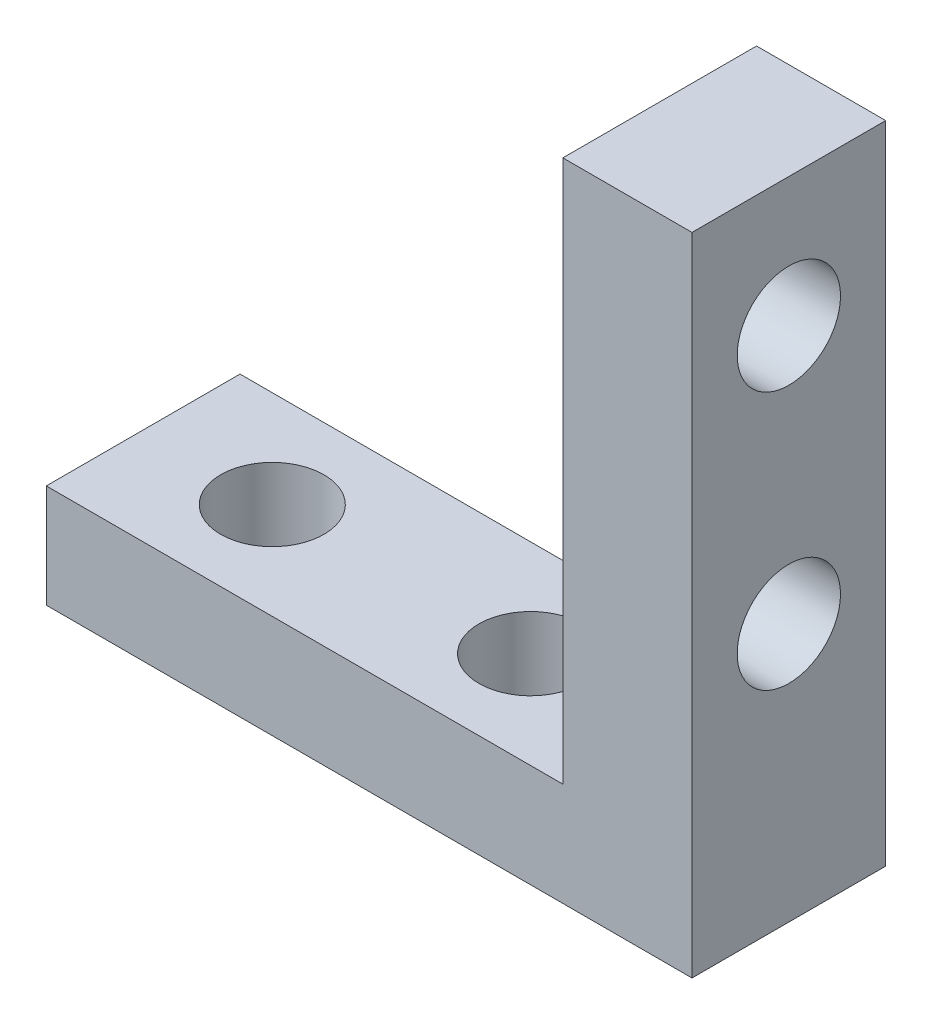
ISO-10303-21;
HEADER;
FILE_DESCRIPTION(('STEP AP214'),'2;1');
FILE_NAME('part.step','',(''),(''),'','','');
FILE_SCHEMA(('AUTOMOTIVE_DESIGN { 1 0 10303 214 1 1 1 1 }'));
ENDSEC;
DATA;
#1=APPLICATION_CONTEXT('core data for automotive mechanical design processes');
#2=APPLICATION_PROTOCOL_DEFINITION('international standard','automotive_design',2000,#1);
#3=PRODUCT_CONTEXT('',#1,'mechanical');
#4=PRODUCT('Part','Part','',(#3));
#5=PRODUCT_RELATED_PRODUCT_CATEGORY('part','',(#4));
#6=PRODUCT_DEFINITION_FORMATION('','',#4);
#7=PRODUCT_DEFINITION_CONTEXT('part definition',#1,'design');
#8=PRODUCT_DEFINITION('design','',#6,#7);
#9=PRODUCT_DEFINITION_SHAPE('','',#8);
#10=(LENGTH_UNIT() NAMED_UNIT(*) SI_UNIT(.MILLI.,.METRE.));
#11=(NAMED_UNIT(*) PLANE_ANGLE_UNIT() SI_UNIT($,.RADIAN.));
#12=(NAMED_UNIT(*) SI_UNIT($,.STERADIAN.) SOLID_ANGLE_UNIT());
#13=UNCERTAINTY_MEASURE_WITH_UNIT(LENGTH_MEASURE(1.E-05),#10,'distance_accuracy_value','');
#14=(GEOMETRIC_REPRESENTATION_CONTEXT(3) GLOBAL_UNCERTAINTY_ASSIGNED_CONTEXT((#13)) GLOBAL_UNIT_ASSIGNED_CONTEXT((#10,
#11,#12)) REPRESENTATION_CONTEXT('',''));
#15=CARTESIAN_POINT('',(0.,0.,0.));
#16=DIRECTION('',(0.,0.,1.));
#17=DIRECTION('',(1.,0.,0.));
#18=AXIS2_PLACEMENT_3D('',#15,#16,#17);
#19=CARTESIAN_POINT('',(0.,4.,0.));
#20=DIRECTION('',(0.,1.,0.));
#21=DIRECTION('',(0.,0.,1.));
#22=AXIS2_PLACEMENT_3D('',#19,#20,#21);
#23=PLANE('',#22);
#24=CARTESIAN_POINT('',(0.,4.,0.));
#25=DIRECTION('',(0.,1.,0.));
#26=DIRECTION('',(0.,0.,1.));
#27=AXIS2_PLACEMENT_3D('',#24,#25,#26);
#28=CIRCLE('',#27,2.);
#29=CARTESIAN_POINT('',(0.,4.,2.));
#30=VERTEX_POINT('',#29);
#31=EDGE_CURVE('E99',#30,#30,#28,.T.);
#32=ORIENTED_EDGE('',*,*,#31,.F.);
#33=EDGE_LOOP('',(#32));
#34=FACE_BOUND('',#33,.T.);
#35=DIRECTION('',(0.,0.,1.));
#36=VECTOR('',#35,1.);
#37=CARTESIAN_POINT('',(-15.,4.,-3.75));
#38=LINE('',#37,#36);
#39=CARTESIAN_POINT('',(-15.,4.,-3.75));
#40=VERTEX_POINT('',#39);
#41=CARTESIAN_POINT('',(-15.,4.,3.75));
#42=VERTEX_POINT('',#41);
#43=EDGE_CURVE('E90',#40,#42,#38,.T.);
#44=ORIENTED_EDGE('',*,*,#43,.T.);
#45=DIRECTION('',(1.,0.,0.));
#46=VECTOR('',#45,1.);
#47=CARTESIAN_POINT('',(-15.,4.,3.75));
#48=LINE('',#47,#46);
#49=CARTESIAN_POINT('',(5.,4.,3.75));
#50=VERTEX_POINT('',#49);
#51=EDGE_CURVE('E84',#42,#50,#48,.T.);
#52=ORIENTED_EDGE('',*,*,#51,.T.);
#53=DIRECTION('',(0.,0.,-1.));
#54=VECTOR('',#53,1.);
#55=CARTESIAN_POINT('',(5.,4.,-3.75));
#56=LINE('',#55,#54);
#57=CARTESIAN_POINT('',(5.,4.,-3.75));
#58=VERTEX_POINT('',#57);
#59=EDGE_CURVE('E73',#50,#58,#56,.T.);
#60=ORIENTED_EDGE('',*,*,#59,.T.);
#61=DIRECTION('',(-1.,0.,0.));
#62=VECTOR('',#61,1.);
#63=CARTESIAN_POINT('',(-15.,4.,-3.75));
#64=LINE('',#63,#62);
#65=EDGE_CURVE('E53',#58,#40,#64,.T.);
#66=ORIENTED_EDGE('',*,*,#65,.T.);
#67=EDGE_LOOP('',(#44,#52,#60,#66));
#68=FACE_BOUND('',#67,.T.);
#69=CARTESIAN_POINT('',(-10.,4.,0.));
#70=DIRECTION('',(0.,1.,0.));
#71=DIRECTION('',(0.,0.,1.));
#72=AXIS2_PLACEMENT_3D('',#69,#70,#71);
#73=CIRCLE('',#72,2.);
#74=CARTESIAN_POINT('',(-10.,4.,2.));
#75=VERTEX_POINT('',#74);
#76=EDGE_CURVE('E156',#75,#75,#73,.T.);
#77=ORIENTED_EDGE('',*,*,#76,.F.);
#78=EDGE_LOOP('',(#77));
#79=FACE_BOUND('',#78,.T.);
#80=ADVANCED_FACE('F34',(#34,#68,#79),#23,.T.);
#81=CARTESIAN_POINT('',(0.,0.,0.));
#82=DIRECTION('',(0.,1.,0.));
#83=DIRECTION('',(0.,0.,1.));
#84=AXIS2_PLACEMENT_3D('',#81,#82,#83);
#85=PLANE('',#84);
#86=CARTESIAN_POINT('',(0.,0.,0.));
#87=DIRECTION('',(0.,1.,0.));
#88=DIRECTION('',(0.,0.,1.));
#89=AXIS2_PLACEMENT_3D('',#86,#87,#88);
#90=CIRCLE('',#89,2.);
#91=CARTESIAN_POINT('',(0.,0.,2.));
#92=VERTEX_POINT('',#91);
#93=EDGE_CURVE('E103',#92,#92,#90,.T.);
#94=ORIENTED_EDGE('',*,*,#93,.T.);
#95=EDGE_LOOP('',(#94));
#96=FACE_BOUND('',#95,.T.);
#97=DIRECTION('',(0.,0.,1.));
#98=VECTOR('',#97,1.);
#99=CARTESIAN_POINT('',(-15.,0.,-3.75));
#100=LINE('',#99,#98);
#101=CARTESIAN_POINT('',(-15.,0.,-3.75));
#102=VERTEX_POINT('',#101);
#103=CARTESIAN_POINT('',(-15.,0.,3.75));
#104=VERTEX_POINT('',#103);
#105=EDGE_CURVE('E97',#102,#104,#100,.T.);
#106=ORIENTED_EDGE('',*,*,#105,.F.);
#107=DIRECTION('',(-1.,0.,0.));
#108=VECTOR('',#107,1.);
#109=CARTESIAN_POINT('',(-15.,0.,-3.75));
#110=LINE('',#109,#108);
#111=CARTESIAN_POINT('',(10.,0.,-3.75));
#112=VERTEX_POINT('',#111);
#113=EDGE_CURVE('E95',#112,#102,#110,.T.);
#114=ORIENTED_EDGE('',*,*,#113,.F.);
#115=DIRECTION('',(0.,0.,-1.));
#116=VECTOR('',#115,1.);
#117=CARTESIAN_POINT('',(10.,0.,3.75));
#118=LINE('',#117,#116);
#119=CARTESIAN_POINT('',(10.,0.,3.75));
#120=VERTEX_POINT('',#119);
#121=EDGE_CURVE('E128',#120,#112,#118,.T.);
#122=ORIENTED_EDGE('',*,*,#121,.F.);
#123=DIRECTION('',(1.,0.,0.));
#124=VECTOR('',#123,1.);
#125=CARTESIAN_POINT('',(-15.,0.,3.75));
#126=LINE('',#125,#124);
#127=EDGE_CURVE('E66',#104,#120,#126,.T.);
#128=ORIENTED_EDGE('',*,*,#127,.F.);
#129=EDGE_LOOP('',(#106,#114,#122,#128));
#130=FACE_BOUND('',#129,.T.);
#131=CARTESIAN_POINT('',(-10.,0.,0.));
#132=DIRECTION('',(0.,1.,0.));
#133=DIRECTION('',(0.,0.,1.));
#134=AXIS2_PLACEMENT_3D('',#131,#132,#133);
#135=CIRCLE('',#134,2.);
#136=CARTESIAN_POINT('',(-10.,0.,2.));
#137=VERTEX_POINT('',#136);
#138=EDGE_CURVE('E159',#137,#137,#135,.T.);
#139=ORIENTED_EDGE('',*,*,#138,.T.);
#140=EDGE_LOOP('',(#139));
#141=FACE_BOUND('',#140,.T.);
#142=ADVANCED_FACE('F125',(#96,#130,#141),#85,.F.);
#143=CARTESIAN_POINT('',(-15.,4.,-3.75));
#144=DIRECTION('',(1.,0.,0.));
#145=DIRECTION('',(0.,0.,-1.));
#146=AXIS2_PLACEMENT_3D('',#143,#144,#145);
#147=PLANE('',#146);
#148=ORIENTED_EDGE('',*,*,#105,.T.);
#149=DIRECTION('',(0.,-1.,0.));
#150=VECTOR('',#149,1.);
#151=CARTESIAN_POINT('',(-15.,4.,3.75));
#152=LINE('',#151,#150);
#153=EDGE_CURVE('E11',#42,#104,#152,.T.);
#154=ORIENTED_EDGE('',*,*,#153,.F.);
#155=ORIENTED_EDGE('',*,*,#43,.F.);
#156=DIRECTION('',(0.,-1.,0.));
#157=VECTOR('',#156,1.);
#158=CARTESIAN_POINT('',(-15.,4.,-3.75));
#159=LINE('',#158,#157);
#160=EDGE_CURVE('E44',#40,#102,#159,.T.);
#161=ORIENTED_EDGE('',*,*,#160,.T.);
#162=EDGE_LOOP('',(#148,#154,#155,#161));
#163=FACE_BOUND('',#162,.T.);
#164=ADVANCED_FACE('F36',(#163),#147,.F.);
#165=CARTESIAN_POINT('',(-15.,4.,3.75));
#166=DIRECTION('',(0.,0.,-1.));
#167=DIRECTION('',(-1.,0.,0.));
#168=AXIS2_PLACEMENT_3D('',#165,#166,#167);
#169=PLANE('',#168);
#170=ORIENTED_EDGE('',*,*,#127,.T.);
#171=DIRECTION('',(0.,-1.,0.));
#172=VECTOR('',#171,1.);
#173=CARTESIAN_POINT('',(10.,0.,3.75));
#174=LINE('',#173,#172);
#175=CARTESIAN_POINT('',(10.,25.,3.75));
#176=VERTEX_POINT('',#175);
#177=EDGE_CURVE('E135',#176,#120,#174,.T.);
#178=ORIENTED_EDGE('',*,*,#177,.F.);
#179=DIRECTION('',(-1.,0.,0.));
#180=VECTOR('',#179,1.);
#181=CARTESIAN_POINT('',(10.,25.,3.75));
#182=LINE('',#181,#180);
#183=CARTESIAN_POINT('',(5.,25.,3.75));
#184=VERTEX_POINT('',#183);
#185=EDGE_CURVE('E144',#176,#184,#182,.T.);
#186=ORIENTED_EDGE('',*,*,#185,.T.);
#187=DIRECTION('',(0.,-1.,0.));
#188=VECTOR('',#187,1.);
#189=CARTESIAN_POINT('',(5.,0.,3.75));
#190=LINE('',#189,#188);
#191=EDGE_CURVE('E89',#184,#50,#190,.T.);
#192=ORIENTED_EDGE('',*,*,#191,.T.);
#193=ORIENTED_EDGE('',*,*,#51,.F.);
#194=ORIENTED_EDGE('',*,*,#153,.T.);
#195=EDGE_LOOP('',(#170,#178,#186,#192,#193,#194));
#196=FACE_BOUND('',#195,.T.);
#197=ADVANCED_FACE('F85',(#196),#169,.F.);
#198=CARTESIAN_POINT('',(-15.,4.,-3.75));
#199=DIRECTION('',(0.,0.,1.));
#200=DIRECTION('',(1.,0.,0.));
#201=AXIS2_PLACEMENT_3D('',#198,#199,#200);
#202=PLANE('',#201);
#203=ORIENTED_EDGE('',*,*,#113,.T.);
#204=ORIENTED_EDGE('',*,*,#160,.F.);
#205=ORIENTED_EDGE('',*,*,#65,.F.);
#206=DIRECTION('',(0.,1.,0.));
#207=VECTOR('',#206,1.);
#208=CARTESIAN_POINT('',(5.,0.,-3.75));
#209=LINE('',#208,#207);
#210=CARTESIAN_POINT('',(5.,25.,-3.75));
#211=VERTEX_POINT('',#210);
#212=EDGE_CURVE('E118',#58,#211,#209,.T.);
#213=ORIENTED_EDGE('',*,*,#212,.T.);
#214=DIRECTION('',(-1.,0.,0.));
#215=VECTOR('',#214,1.);
#216=CARTESIAN_POINT('',(10.,25.,-3.75));
#217=LINE('',#216,#215);
#218=CARTESIAN_POINT('',(10.,25.,-3.75));
#219=VERTEX_POINT('',#218);
#220=EDGE_CURVE('E153',#219,#211,#217,.T.);
#221=ORIENTED_EDGE('',*,*,#220,.F.);
#222=DIRECTION('',(0.,1.,0.));
#223=VECTOR('',#222,1.);
#224=CARTESIAN_POINT('',(10.,0.,-3.75));
#225=LINE('',#224,#223);
#226=EDGE_CURVE('E123',#112,#219,#225,.T.);
#227=ORIENTED_EDGE('',*,*,#226,.F.);
#228=EDGE_LOOP('',(#203,#204,#205,#213,#221,#227));
#229=FACE_BOUND('',#228,.T.);
#230=ADVANCED_FACE('F115',(#229),#202,.F.);
#231=CARTESIAN_POINT('',(0.,4.,0.));
#232=DIRECTION('',(0.,-1.,0.));
#233=DIRECTION('',(0.,0.,-1.));
#234=AXIS2_PLACEMENT_3D('',#231,#232,#233);
#235=CYLINDRICAL_SURFACE('',#234,2.);
#236=ORIENTED_EDGE('',*,*,#31,.T.);
#237=EDGE_LOOP('',(#236));
#238=FACE_BOUND('',#237,.T.);
#239=ORIENTED_EDGE('',*,*,#93,.F.);
#240=EDGE_LOOP('',(#239));
#241=FACE_BOUND('',#240,.T.);
#242=ADVANCED_FACE('F166',(#238,#241),#235,.F.);
#243=CARTESIAN_POINT('',(-10.,4.,0.));
#244=DIRECTION('',(0.,-1.,0.));
#245=DIRECTION('',(0.,0.,-1.));
#246=AXIS2_PLACEMENT_3D('',#243,#244,#245);
#247=CYLINDRICAL_SURFACE('',#246,2.);
#248=ORIENTED_EDGE('',*,*,#76,.T.);
#249=EDGE_LOOP('',(#248));
#250=FACE_BOUND('',#249,.T.);
#251=ORIENTED_EDGE('',*,*,#138,.F.);
#252=EDGE_LOOP('',(#251));
#253=FACE_BOUND('',#252,.T.);
#254=ADVANCED_FACE('F168',(#250,#253),#247,.F.);
#255=CARTESIAN_POINT('',(5.,0.,0.));
#256=DIRECTION('',(-1.,0.,0.));
#257=DIRECTION('',(0.,0.,1.));
#258=AXIS2_PLACEMENT_3D('',#255,#256,#257);
#259=PLANE('',#258);
#260=CARTESIAN_POINT('',(5.,10.,0.));
#261=DIRECTION('',(1.,0.,0.));
#262=DIRECTION('',(0.,0.,-1.));
#263=AXIS2_PLACEMENT_3D('',#260,#261,#262);
#264=CIRCLE('',#263,2.);
#265=CARTESIAN_POINT('',(5.,10.,-2.));
#266=VERTEX_POINT('',#265);
#267=EDGE_CURVE('E287',#266,#266,#264,.T.);
#268=ORIENTED_EDGE('',*,*,#267,.T.);
#269=EDGE_LOOP('',(#268));
#270=FACE_BOUND('',#269,.T.);
#271=CARTESIAN_POINT('',(5.,20.,0.));
#272=DIRECTION('',(1.,0.,0.));
#273=DIRECTION('',(0.,0.,-1.));
#274=AXIS2_PLACEMENT_3D('',#271,#272,#273);
#275=CIRCLE('',#274,2.);
#276=CARTESIAN_POINT('',(5.,20.,-2.));
#277=VERTEX_POINT('',#276);
#278=EDGE_CURVE('E289',#277,#277,#275,.T.);
#279=ORIENTED_EDGE('',*,*,#278,.T.);
#280=EDGE_LOOP('',(#279));
#281=FACE_BOUND('',#280,.T.);
#282=ORIENTED_EDGE('',*,*,#59,.F.);
#283=ORIENTED_EDGE('',*,*,#191,.F.);
#284=DIRECTION('',(0.,0.,1.));
#285=VECTOR('',#284,1.);
#286=CARTESIAN_POINT('',(5.,25.,3.75));
#287=LINE('',#286,#285);
#288=EDGE_CURVE('E139',#211,#184,#287,.T.);
#289=ORIENTED_EDGE('',*,*,#288,.F.);
#290=ORIENTED_EDGE('',*,*,#212,.F.);
#291=EDGE_LOOP('',(#282,#283,#289,#290));
#292=FACE_BOUND('',#291,.T.);
#293=ADVANCED_FACE('F175',(#270,#281,#292),#259,.T.);
#294=CARTESIAN_POINT('',(10.,0.,0.));
#295=DIRECTION('',(-1.,0.,0.));
#296=DIRECTION('',(0.,0.,1.));
#297=AXIS2_PLACEMENT_3D('',#294,#295,#296);
#298=PLANE('',#297);
#299=CARTESIAN_POINT('',(10.,20.,0.));
#300=DIRECTION('',(1.,0.,0.));
#301=DIRECTION('',(0.,0.,-1.));
#302=AXIS2_PLACEMENT_3D('',#299,#300,#301);
#303=CIRCLE('',#302,2.);
#304=CARTESIAN_POINT('',(10.,20.,-2.));
#305=VERTEX_POINT('',#304);
#306=EDGE_CURVE('E152',#305,#305,#303,.T.);
#307=ORIENTED_EDGE('',*,*,#306,.F.);
#308=EDGE_LOOP('',(#307));
#309=FACE_BOUND('',#308,.T.);
#310=ORIENTED_EDGE('',*,*,#177,.T.);
#311=ORIENTED_EDGE('',*,*,#121,.T.);
#312=ORIENTED_EDGE('',*,*,#226,.T.);
#313=DIRECTION('',(0.,0.,1.));
#314=VECTOR('',#313,1.);
#315=CARTESIAN_POINT('',(10.,25.,3.75));
#316=LINE('',#315,#314);
#317=EDGE_CURVE('E137',#219,#176,#316,.T.);
#318=ORIENTED_EDGE('',*,*,#317,.T.);
#319=EDGE_LOOP('',(#310,#311,#312,#318));
#320=FACE_BOUND('',#319,.T.);
#321=CARTESIAN_POINT('',(10.,10.,0.));
#322=DIRECTION('',(1.,0.,0.));
#323=DIRECTION('',(0.,0.,-1.));
#324=AXIS2_PLACEMENT_3D('',#321,#322,#323);
#325=CIRCLE('',#324,2.);
#326=CARTESIAN_POINT('',(10.,10.,-2.));
#327=VERTEX_POINT('',#326);
#328=EDGE_CURVE('E284',#327,#327,#325,.T.);
#329=ORIENTED_EDGE('',*,*,#328,.F.);
#330=EDGE_LOOP('',(#329));
#331=FACE_BOUND('',#330,.T.);
#332=ADVANCED_FACE('F132',(#309,#320,#331),#298,.F.);
#333=CARTESIAN_POINT('',(10.,25.,3.75));
#334=DIRECTION('',(0.,-1.,0.));
#335=DIRECTION('',(0.,0.,-1.));
#336=AXIS2_PLACEMENT_3D('',#333,#334,#335);
#337=PLANE('',#336);
#338=ORIENTED_EDGE('',*,*,#288,.T.);
#339=ORIENTED_EDGE('',*,*,#185,.F.);
#340=ORIENTED_EDGE('',*,*,#317,.F.);
#341=ORIENTED_EDGE('',*,*,#220,.T.);
#342=EDGE_LOOP('',(#338,#339,#340,#341));
#343=FACE_BOUND('',#342,.T.);
#344=ADVANCED_FACE('F247',(#343),#337,.F.);
#345=CARTESIAN_POINT('',(10.,20.,0.));
#346=DIRECTION('',(-1.,0.,0.));
#347=DIRECTION('',(0.,0.,1.));
#348=AXIS2_PLACEMENT_3D('',#345,#346,#347);
#349=CYLINDRICAL_SURFACE('',#348,2.);
#350=ORIENTED_EDGE('',*,*,#306,.T.);
#351=EDGE_LOOP('',(#350));
#352=FACE_BOUND('',#351,.T.);
#353=ORIENTED_EDGE('',*,*,#278,.F.);
#354=EDGE_LOOP('',(#353));
#355=FACE_BOUND('',#354,.T.);
#356=ADVANCED_FACE('F257',(#352,#355),#349,.F.);
#357=CARTESIAN_POINT('',(10.,10.,0.));
#358=DIRECTION('',(-1.,0.,0.));
#359=DIRECTION('',(0.,0.,1.));
#360=AXIS2_PLACEMENT_3D('',#357,#358,#359);
#361=CYLINDRICAL_SURFACE('',#360,2.);
#362=ORIENTED_EDGE('',*,*,#328,.T.);
#363=EDGE_LOOP('',(#362));
#364=FACE_BOUND('',#363,.T.);
#365=ORIENTED_EDGE('',*,*,#267,.F.);
#366=EDGE_LOOP('',(#365));
#367=FACE_BOUND('',#366,.T.);
#368=ADVANCED_FACE('F267',(#364,#367),#361,.F.);
#369=CLOSED_SHELL('',(#80,#142,#164,#197,#230,#242,#254,#293,#332,#344,#356,#368));
#370=MANIFOLD_SOLID_BREP('B2',#369);
#371=ADVANCED_BREP_SHAPE_REPRESENTATION('',(#18,#370),#14);
#372=SHAPE_DEFINITION_REPRESENTATION(#9,#371);
ENDSEC;
END-ISO-10303-21;
